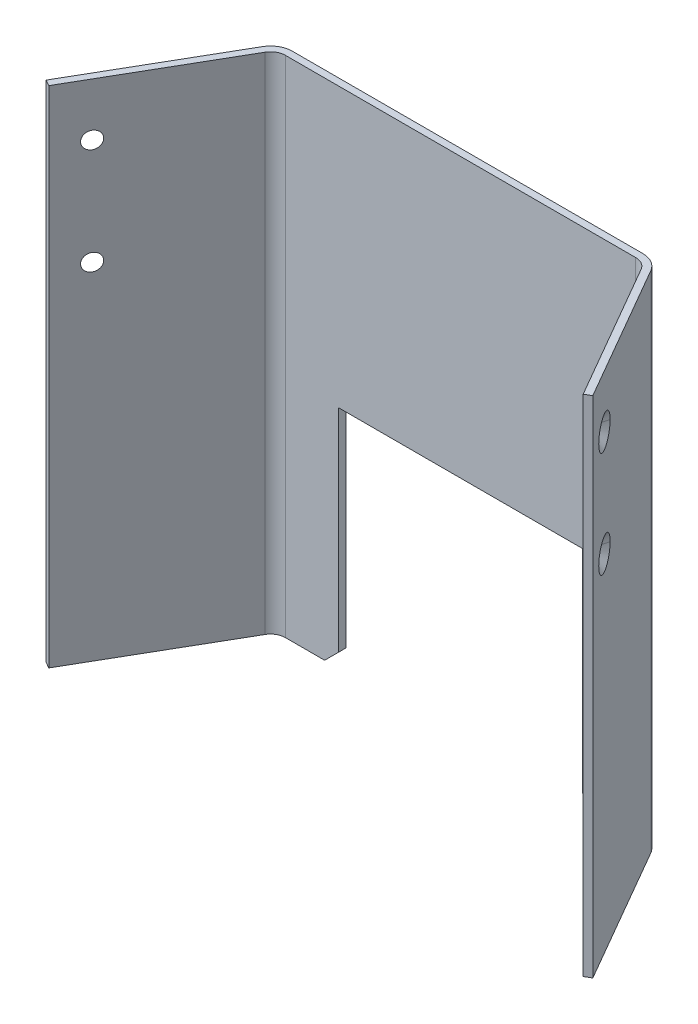
ISO-10303-21;
HEADER;
FILE_DESCRIPTION(('STEP AP214'),'2;1');
FILE_NAME('part.step','',(''),(''),'','','');
FILE_SCHEMA(('AUTOMOTIVE_DESIGN { 1 0 10303 214 1 1 1 1 }'));
ENDSEC;
DATA;
#1=APPLICATION_CONTEXT('core data for automotive mechanical design processes');
#2=APPLICATION_PROTOCOL_DEFINITION('international standard','automotive_design',2000,#1);
#3=PRODUCT_CONTEXT('',#1,'mechanical');
#4=PRODUCT('Part','Part','',(#3));
#5=PRODUCT_RELATED_PRODUCT_CATEGORY('part','',(#4));
#6=PRODUCT_DEFINITION_FORMATION('','',#4);
#7=PRODUCT_DEFINITION_CONTEXT('part definition',#1,'design');
#8=PRODUCT_DEFINITION('design','',#6,#7);
#9=PRODUCT_DEFINITION_SHAPE('','',#8);
#10=(LENGTH_UNIT() NAMED_UNIT(*) SI_UNIT(.MILLI.,.METRE.));
#11=(NAMED_UNIT(*) PLANE_ANGLE_UNIT() SI_UNIT($,.RADIAN.));
#12=(NAMED_UNIT(*) SI_UNIT($,.STERADIAN.) SOLID_ANGLE_UNIT());
#13=UNCERTAINTY_MEASURE_WITH_UNIT(LENGTH_MEASURE(1.E-05),#10,'distance_accuracy_value','');
#14=(GEOMETRIC_REPRESENTATION_CONTEXT(3) GLOBAL_UNCERTAINTY_ASSIGNED_CONTEXT((#13)) GLOBAL_UNIT_ASSIGNED_CONTEXT((#10,
#11,#12)) REPRESENTATION_CONTEXT('',''));
#15=CARTESIAN_POINT('',(0.,0.,0.));
#16=DIRECTION('',(0.,0.,1.));
#17=DIRECTION('',(1.,0.,0.));
#18=AXIS2_PLACEMENT_3D('',#15,#16,#17);
#19=CARTESIAN_POINT('',(-36.5,64.,17.1028856829701));
#20=DIRECTION('',(-0.86602540378444,0.,-0.5));
#21=DIRECTION('',(-0.5,0.,0.86602540378444));
#22=AXIS2_PLACEMENT_3D('',#19,#20,#21);
#23=CONICAL_SURFACE('',#22,2.2,0.78539816339744);
#24=CARTESIAN_POINT('',(-35.6339745962155,64.,17.6028856829701));
#25=DIRECTION('',(-0.866025403784439,0.,-0.5));
#26=DIRECTION('',(-0.5,0.,0.866025403784439));
#27=AXIS2_PLACEMENT_3D('',#24,#25,#26);
#28=CIRCLE('',#27,1.2);
#29=CARTESIAN_POINT('',(-35.0339745962156,64.,16.5636551984287));
#30=VERTEX_POINT('',#29);
#31=CARTESIAN_POINT('',(-36.2339745962156,64.,18.6421161675114));
#32=VERTEX_POINT('',#31);
#33=EDGE_CURVE('E41',#30,#32,#28,.T.);
#34=ORIENTED_EDGE('',*,*,#33,.F.);
#35=DIRECTION('',(-0.258819045102532,0.,-0.965925826289066));
#36=VECTOR('',#35,1.);
#37=CARTESIAN_POINT('',(-35.4,64.,15.1976297946443));
#38=LINE('',#37,#36);
#39=CARTESIAN_POINT('',(-35.4,64.,15.1976297946443));
#40=VERTEX_POINT('',#39);
#41=EDGE_CURVE('E11',#30,#40,#38,.T.);
#42=ORIENTED_EDGE('',*,*,#41,.T.);
#43=CARTESIAN_POINT('',(-36.5,64.,17.1028856829701));
#44=DIRECTION('',(-0.86602540378444,0.,-0.5));
#45=DIRECTION('',(-0.5,0.,0.86602540378444));
#46=AXIS2_PLACEMENT_3D('',#43,#44,#45);
#47=CIRCLE('',#46,2.2);
#48=CARTESIAN_POINT('',(-37.6,64.,19.0081415712958));
#49=VERTEX_POINT('',#48);
#50=EDGE_CURVE('E27',#40,#49,#47,.T.);
#51=ORIENTED_EDGE('',*,*,#50,.T.);
#52=DIRECTION('',(-0.96592582628907,0.,0.258819045102515));
#53=VECTOR('',#52,1.);
#54=CARTESIAN_POINT('',(-37.6,64.,19.0081415712958));
#55=LINE('',#54,#53);
#56=EDGE_CURVE('E262',#32,#49,#55,.T.);
#57=ORIENTED_EDGE('',*,*,#56,.F.);
#58=EDGE_LOOP('',(#34,#42,#51,#57));
#59=FACE_BOUND('',#58,.T.);
#60=ADVANCED_FACE('F16',(#59),#23,.F.);
#61=CARTESIAN_POINT('',(-36.5,49.,17.1028856829701));
#62=DIRECTION('',(-0.86602540378444,0.,-0.5));
#63=DIRECTION('',(-0.5,0.,0.86602540378444));
#64=AXIS2_PLACEMENT_3D('',#61,#62,#63);
#65=CONICAL_SURFACE('',#64,2.2,0.785398163397447);
#66=CARTESIAN_POINT('',(-35.6339745962155,49.,17.6028856829701));
#67=DIRECTION('',(-0.866025403784441,0.,-0.5));
#68=DIRECTION('',(-0.5,0.,0.866025403784441));
#69=AXIS2_PLACEMENT_3D('',#66,#67,#68);
#70=CIRCLE('',#69,1.2);
#71=CARTESIAN_POINT('',(-35.0339745962156,49.,16.5636551984287));
#72=VERTEX_POINT('',#71);
#73=CARTESIAN_POINT('',(-36.2339745962156,49.,18.6421161675114));
#74=VERTEX_POINT('',#73);
#75=EDGE_CURVE('E311',#72,#74,#70,.T.);
#76=ORIENTED_EDGE('',*,*,#75,.F.);
#77=DIRECTION('',(-0.258819045102525,0.,-0.965925826289067));
#78=VECTOR('',#77,1.);
#79=CARTESIAN_POINT('',(-35.4,49.,15.1976297946443));
#80=LINE('',#79,#78);
#81=CARTESIAN_POINT('',(-35.4,49.,15.1976297946443));
#82=VERTEX_POINT('',#81);
#83=EDGE_CURVE('E255',#72,#82,#80,.T.);
#84=ORIENTED_EDGE('',*,*,#83,.T.);
#85=CARTESIAN_POINT('',(-36.5,49.,17.1028856829701));
#86=DIRECTION('',(-0.86602540378444,0.,-0.5));
#87=DIRECTION('',(-0.5,0.,0.86602540378444));
#88=AXIS2_PLACEMENT_3D('',#85,#86,#87);
#89=CIRCLE('',#88,2.2);
#90=CARTESIAN_POINT('',(-37.6,49.,19.0081415712958));
#91=VERTEX_POINT('',#90);
#92=EDGE_CURVE('E253',#82,#91,#89,.T.);
#93=ORIENTED_EDGE('',*,*,#92,.T.);
#94=DIRECTION('',(-0.965925826289068,0.,0.258819045102522));
#95=VECTOR('',#94,1.);
#96=CARTESIAN_POINT('',(-37.6,49.,19.0081415712958));
#97=LINE('',#96,#95);
#98=EDGE_CURVE('E235',#74,#91,#97,.T.);
#99=ORIENTED_EDGE('',*,*,#98,.F.);
#100=EDGE_LOOP('',(#76,#84,#93,#99));
#101=FACE_BOUND('',#100,.T.);
#102=ADVANCED_FACE('F254',(#101),#65,.F.);
#103=CARTESIAN_POINT('',(36.5,64.,17.1028856829701));
#104=DIRECTION('',(0.866025403784439,0.,-0.5));
#105=DIRECTION('',(-0.5,0.,-0.866025403784439));
#106=AXIS2_PLACEMENT_3D('',#103,#104,#105);
#107=CONICAL_SURFACE('',#106,2.2,0.785398163397443);
#108=CARTESIAN_POINT('',(35.6339745962156,64.,17.6028856829701));
#109=DIRECTION('',(0.866025403784439,0.,-0.5));
#110=DIRECTION('',(-0.5,0.,-0.866025403784439));
#111=AXIS2_PLACEMENT_3D('',#108,#109,#110);
#112=CIRCLE('',#111,1.2);
#113=CARTESIAN_POINT('',(36.2339745962156,64.,18.6421161675114));
#114=VERTEX_POINT('',#113);
#115=CARTESIAN_POINT('',(35.0339745962156,64.,16.5636551984287));
#116=VERTEX_POINT('',#115);
#117=EDGE_CURVE('E310',#114,#116,#112,.T.);
#118=ORIENTED_EDGE('',*,*,#117,.F.);
#119=DIRECTION('',(0.96592582628907,0.,0.258819045102516));
#120=VECTOR('',#119,1.);
#121=CARTESIAN_POINT('',(37.6,64.,19.0081415712958));
#122=LINE('',#121,#120);
#123=CARTESIAN_POINT('',(37.6,64.,19.0081415712958));
#124=VERTEX_POINT('',#123);
#125=EDGE_CURVE('E258',#114,#124,#122,.T.);
#126=ORIENTED_EDGE('',*,*,#125,.T.);
#127=CARTESIAN_POINT('',(36.5,64.,17.1028856829701));
#128=DIRECTION('',(0.866025403784439,0.,-0.5));
#129=DIRECTION('',(-0.5,0.,-0.866025403784439));
#130=AXIS2_PLACEMENT_3D('',#127,#128,#129);
#131=CIRCLE('',#130,2.2);
#132=CARTESIAN_POINT('',(35.4,64.,15.1976297946443));
#133=VERTEX_POINT('',#132);
#134=EDGE_CURVE('E407',#124,#133,#131,.T.);
#135=ORIENTED_EDGE('',*,*,#134,.T.);
#136=DIRECTION('',(0.258819045102526,0.,-0.965925826289067));
#137=VECTOR('',#136,1.);
#138=CARTESIAN_POINT('',(35.4,64.,15.1976297946443));
#139=LINE('',#138,#137);
#140=EDGE_CURVE('E208',#116,#133,#139,.T.);
#141=ORIENTED_EDGE('',*,*,#140,.F.);
#142=EDGE_LOOP('',(#118,#126,#135,#141));
#143=FACE_BOUND('',#142,.T.);
#144=ADVANCED_FACE('F624',(#143),#107,.F.);
#145=CARTESIAN_POINT('',(36.5,49.,17.1028856829701));
#146=DIRECTION('',(0.866025403784438,0.,-0.5));
#147=DIRECTION('',(-0.5,0.,-0.866025403784438));
#148=AXIS2_PLACEMENT_3D('',#145,#146,#147);
#149=CONICAL_SURFACE('',#148,2.2,0.78539816339745);
#150=CARTESIAN_POINT('',(35.6339745962156,49.,17.6028856829701));
#151=DIRECTION('',(0.866025403784438,0.,-0.5));
#152=DIRECTION('',(-0.5,0.,-0.866025403784438));
#153=AXIS2_PLACEMENT_3D('',#150,#151,#152);
#154=CIRCLE('',#153,1.2);
#155=CARTESIAN_POINT('',(36.2339745962156,49.,18.6421161675114));
#156=VERTEX_POINT('',#155);
#157=CARTESIAN_POINT('',(35.0339745962156,49.,16.5636551984287));
#158=VERTEX_POINT('',#157);
#159=EDGE_CURVE('E291',#156,#158,#154,.T.);
#160=ORIENTED_EDGE('',*,*,#159,.F.);
#161=DIRECTION('',(0.965925826289068,0.,0.258819045102522));
#162=VECTOR('',#161,1.);
#163=CARTESIAN_POINT('',(37.6,49.,19.0081415712958));
#164=LINE('',#163,#162);
#165=CARTESIAN_POINT('',(37.6,49.,19.0081415712958));
#166=VERTEX_POINT('',#165);
#167=EDGE_CURVE('E354',#156,#166,#164,.T.);
#168=ORIENTED_EDGE('',*,*,#167,.T.);
#169=CARTESIAN_POINT('',(36.5,49.,17.1028856829701));
#170=DIRECTION('',(0.866025403784438,0.,-0.5));
#171=DIRECTION('',(-0.5,0.,-0.866025403784438));
#172=AXIS2_PLACEMENT_3D('',#169,#170,#171);
#173=CIRCLE('',#172,2.2);
#174=CARTESIAN_POINT('',(35.4,49.,15.1976297946443));
#175=VERTEX_POINT('',#174);
#176=EDGE_CURVE('E350',#166,#175,#173,.T.);
#177=ORIENTED_EDGE('',*,*,#176,.T.);
#178=DIRECTION('',(0.258819045102519,0.,-0.965925826289069));
#179=VECTOR('',#178,1.);
#180=CARTESIAN_POINT('',(35.4,49.,15.1976297946443));
#181=LINE('',#180,#179);
#182=EDGE_CURVE('E448',#158,#175,#181,.T.);
#183=ORIENTED_EDGE('',*,*,#182,.F.);
#184=EDGE_LOOP('',(#160,#168,#177,#183));
#185=FACE_BOUND('',#184,.T.);
#186=ADVANCED_FACE('F680',(#185),#149,.F.);
#187=CARTESIAN_POINT('',(24.83585851253,0.,3.1));
#188=DIRECTION('',(0.,-1.,0.));
#189=DIRECTION('',(0.,0.,-1.));
#190=AXIS2_PLACEMENT_3D('',#187,#188,#189);
#191=PLANE('',#190);
#192=DIRECTION('',(1.,0.,0.));
#193=VECTOR('',#192,1.);
#194=CARTESIAN_POINT('',(-24.83585851253,0.,1.));
#195=LINE('',#194,#193);
#196=CARTESIAN_POINT('',(19.2710634256353,0.,1.));
#197=VERTEX_POINT('',#196);
#198=CARTESIAN_POINT('',(24.83585851253,0.,1.));
#199=VERTEX_POINT('',#198);
#200=EDGE_CURVE('E333',#197,#199,#195,.T.);
#201=ORIENTED_EDGE('',*,*,#200,.F.);
#202=DIRECTION('',(0.,0.,-1.));
#203=VECTOR('',#202,1.);
#204=CARTESIAN_POINT('',(19.2710634256353,0.,0.));
#205=LINE('',#204,#203);
#206=CARTESIAN_POINT('',(19.2710634256353,0.,0.));
#207=VERTEX_POINT('',#206);
#208=EDGE_CURVE('E355',#197,#207,#205,.T.);
#209=ORIENTED_EDGE('',*,*,#208,.T.);
#210=DIRECTION('',(1.,0.,0.));
#211=VECTOR('',#210,1.);
#212=CARTESIAN_POINT('',(-24.83585851253,0.,0.));
#213=LINE('',#212,#211);
#214=CARTESIAN_POINT('',(24.83585851253,0.,0.));
#215=VERTEX_POINT('',#214);
#216=EDGE_CURVE('E367',#207,#215,#213,.T.);
#217=ORIENTED_EDGE('',*,*,#216,.T.);
#218=CARTESIAN_POINT('',(24.83585851253,0.,3.1));
#219=DIRECTION('',(0.,-1.,0.));
#220=DIRECTION('',(0.,0.,1.));
#221=AXIS2_PLACEMENT_3D('',#218,#219,#220);
#222=CIRCLE('',#221,3.1);
#223=CARTESIAN_POINT('',(27.5205372642618,0.,1.55));
#224=VERTEX_POINT('',#223);
#225=EDGE_CURVE('E318',#215,#224,#222,.T.);
#226=ORIENTED_EDGE('',*,*,#225,.T.);
#227=DIRECTION('',(0.5,0.,0.866025403784439));
#228=VECTOR('',#227,1.);
#229=CARTESIAN_POINT('',(27.5205372642618,0.,1.55));
#230=LINE('',#229,#228);
#231=CARTESIAN_POINT('',(38.75,0.,21.));
#232=VERTEX_POINT('',#231);
#233=EDGE_CURVE('E314',#224,#232,#230,.T.);
#234=ORIENTED_EDGE('',*,*,#233,.T.);
#235=DIRECTION('',(-0.866025403784443,0.,0.499999999999993));
#236=VECTOR('',#235,1.);
#237=CARTESIAN_POINT('',(38.75,0.,21.));
#238=LINE('',#237,#236);
#239=CARTESIAN_POINT('',(37.8839745962156,0.,21.5));
#240=VERTEX_POINT('',#239);
#241=EDGE_CURVE('E319',#232,#240,#238,.T.);
#242=ORIENTED_EDGE('',*,*,#241,.T.);
#243=DIRECTION('',(0.5,0.,0.866025403784439));
#244=VECTOR('',#243,1.);
#245=CARTESIAN_POINT('',(26.6545118604773,0.,2.05));
#246=LINE('',#245,#244);
#247=CARTESIAN_POINT('',(26.6545118604773,0.,2.05));
#248=VERTEX_POINT('',#247);
#249=EDGE_CURVE('E417',#248,#240,#246,.T.);
#250=ORIENTED_EDGE('',*,*,#249,.F.);
#251=CARTESIAN_POINT('',(24.83585851253,0.,3.1));
#252=DIRECTION('',(0.,-1.,0.));
#253=DIRECTION('',(1.,0.,0.));
#254=AXIS2_PLACEMENT_3D('',#251,#252,#253);
#255=CIRCLE('',#254,2.1);
#256=EDGE_CURVE('E334',#199,#248,#255,.T.);
#257=ORIENTED_EDGE('',*,*,#256,.F.);
#258=EDGE_LOOP('',(#201,#209,#217,#226,#234,#242,#250,#257));
#259=FACE_BOUND('',#258,.T.);
#260=ADVANCED_FACE('F18',(#259),#191,.T.);
#261=CARTESIAN_POINT('',(26.6545118604773,71.5,2.05));
#262=DIRECTION('',(0.866025403784439,0.,-0.5));
#263=DIRECTION('',(0.,-1.,0.));
#264=AXIS2_PLACEMENT_3D('',#261,#262,#263);
#265=PLANE('',#264);
#266=ORIENTED_EDGE('',*,*,#249,.T.);
#267=DIRECTION('',(0.,-1.,0.));
#268=VECTOR('',#267,1.);
#269=CARTESIAN_POINT('',(37.8839745962156,71.5,21.5));
#270=LINE('',#269,#268);
#271=CARTESIAN_POINT('',(37.8839745962156,71.5,21.5));
#272=VERTEX_POINT('',#271);
#273=EDGE_CURVE('E388',#272,#240,#270,.T.);
#274=ORIENTED_EDGE('',*,*,#273,.F.);
#275=DIRECTION('',(0.5,0.,0.866025403784439));
#276=VECTOR('',#275,1.);
#277=CARTESIAN_POINT('',(26.6545118604773,71.5,2.05));
#278=LINE('',#277,#276);
#279=CARTESIAN_POINT('',(26.6545118604773,71.5,2.05));
#280=VERTEX_POINT('',#279);
#281=EDGE_CURVE('E372',#280,#272,#278,.T.);
#282=ORIENTED_EDGE('',*,*,#281,.F.);
#283=DIRECTION('',(0.,-1.,0.));
#284=VECTOR('',#283,1.);
#285=CARTESIAN_POINT('',(26.6545118604773,71.5,2.05));
#286=LINE('',#285,#284);
#287=EDGE_CURVE('E420',#280,#248,#286,.T.);
#288=ORIENTED_EDGE('',*,*,#287,.T.);
#289=EDGE_LOOP('',(#266,#274,#282,#288));
#290=FACE_BOUND('',#289,.T.);
#291=CARTESIAN_POINT('',(35.6339745962156,64.,17.6028856829701));
#292=DIRECTION('',(0.866025403784439,0.,-0.5));
#293=DIRECTION('',(-0.5,0.,-0.866025403784439));
#294=AXIS2_PLACEMENT_3D('',#291,#292,#293);
#295=CIRCLE('',#294,1.2);
#296=EDGE_CURVE('E381',#116,#114,#295,.T.);
#297=ORIENTED_EDGE('',*,*,#296,.T.);
#298=ORIENTED_EDGE('',*,*,#117,.T.);
#299=EDGE_LOOP('',(#297,#298));
#300=FACE_BOUND('',#299,.T.);
#301=CARTESIAN_POINT('',(35.6339745962156,49.,17.6028856829701));
#302=DIRECTION('',(0.866025403784438,0.,-0.5));
#303=DIRECTION('',(-0.5,0.,-0.866025403784438));
#304=AXIS2_PLACEMENT_3D('',#301,#302,#303);
#305=CIRCLE('',#304,1.2);
#306=EDGE_CURVE('E294',#158,#156,#305,.T.);
#307=ORIENTED_EDGE('',*,*,#306,.T.);
#308=ORIENTED_EDGE('',*,*,#159,.T.);
#309=EDGE_LOOP('',(#307,#308));
#310=FACE_BOUND('',#309,.T.);
#311=ADVANCED_FACE('F550',(#290,#300,#310),#265,.F.);
#312=CARTESIAN_POINT('',(38.75,71.5,21.));
#313=DIRECTION('',(0.499999999999993,0.,0.866025403784443));
#314=DIRECTION('',(0.,-1.,0.));
#315=AXIS2_PLACEMENT_3D('',#312,#313,#314);
#316=PLANE('',#315);
#317=ORIENTED_EDGE('',*,*,#241,.F.);
#318=DIRECTION('',(0.,-1.,0.));
#319=VECTOR('',#318,1.);
#320=CARTESIAN_POINT('',(38.75,71.5,21.));
#321=LINE('',#320,#319);
#322=CARTESIAN_POINT('',(38.75,71.5,21.));
#323=VERTEX_POINT('',#322);
#324=EDGE_CURVE('E279',#323,#232,#321,.T.);
#325=ORIENTED_EDGE('',*,*,#324,.F.);
#326=DIRECTION('',(-0.866025403784443,0.,0.499999999999993));
#327=VECTOR('',#326,1.);
#328=CARTESIAN_POINT('',(38.75,71.5,21.));
#329=LINE('',#328,#327);
#330=EDGE_CURVE('E274',#323,#272,#329,.T.);
#331=ORIENTED_EDGE('',*,*,#330,.T.);
#332=ORIENTED_EDGE('',*,*,#273,.T.);
#333=EDGE_LOOP('',(#317,#325,#331,#332));
#334=FACE_BOUND('',#333,.T.);
#335=ADVANCED_FACE('F644',(#334),#316,.T.);
#336=CARTESIAN_POINT('',(27.5205372642618,71.5,1.55));
#337=DIRECTION('',(0.866025403784439,0.,-0.5));
#338=DIRECTION('',(0.,-1.,0.));
#339=AXIS2_PLACEMENT_3D('',#336,#337,#338);
#340=PLANE('',#339);
#341=ORIENTED_EDGE('',*,*,#233,.F.);
#342=DIRECTION('',(0.,-1.,0.));
#343=VECTOR('',#342,1.);
#344=CARTESIAN_POINT('',(27.5205372642618,71.5,1.55));
#345=LINE('',#344,#343);
#346=CARTESIAN_POINT('',(27.5205372642618,71.5,1.55));
#347=VERTEX_POINT('',#346);
#348=EDGE_CURVE('E280',#347,#224,#345,.T.);
#349=ORIENTED_EDGE('',*,*,#348,.F.);
#350=DIRECTION('',(0.5,0.,0.866025403784439));
#351=VECTOR('',#350,1.);
#352=CARTESIAN_POINT('',(27.5205372642618,71.5,1.55));
#353=LINE('',#352,#351);
#354=EDGE_CURVE('E392',#347,#323,#353,.T.);
#355=ORIENTED_EDGE('',*,*,#354,.T.);
#356=ORIENTED_EDGE('',*,*,#324,.T.);
#357=EDGE_LOOP('',(#341,#349,#355,#356));
#358=FACE_BOUND('',#357,.T.);
#359=CARTESIAN_POINT('',(36.5,64.,17.1028856829701));
#360=DIRECTION('',(0.866025403784439,0.,-0.5));
#361=DIRECTION('',(-0.5,0.,-0.866025403784439));
#362=AXIS2_PLACEMENT_3D('',#359,#360,#361);
#363=CIRCLE('',#362,2.2);
#364=EDGE_CURVE('E250',#133,#124,#363,.T.);
#365=ORIENTED_EDGE('',*,*,#364,.F.);
#366=ORIENTED_EDGE('',*,*,#134,.F.);
#367=EDGE_LOOP('',(#365,#366));
#368=FACE_BOUND('',#367,.T.);
#369=CARTESIAN_POINT('',(36.5,49.,17.1028856829701));
#370=DIRECTION('',(0.866025403784438,0.,-0.5));
#371=DIRECTION('',(-0.5,0.,-0.866025403784438));
#372=AXIS2_PLACEMENT_3D('',#369,#370,#371);
#373=CIRCLE('',#372,2.2);
#374=EDGE_CURVE('E446',#175,#166,#373,.T.);
#375=ORIENTED_EDGE('',*,*,#374,.F.);
#376=ORIENTED_EDGE('',*,*,#176,.F.);
#377=EDGE_LOOP('',(#375,#376));
#378=FACE_BOUND('',#377,.T.);
#379=ADVANCED_FACE('F575',(#358,#368,#378),#340,.T.);
#380=CARTESIAN_POINT('',(24.83585851253,71.5,3.1));
#381=DIRECTION('',(0.,-1.,0.));
#382=DIRECTION('',(0.,0.,-1.));
#383=AXIS2_PLACEMENT_3D('',#380,#381,#382);
#384=CYLINDRICAL_SURFACE('',#383,3.1);
#385=ORIENTED_EDGE('',*,*,#225,.F.);
#386=DIRECTION('',(0.,-1.,0.));
#387=VECTOR('',#386,1.);
#388=CARTESIAN_POINT('',(24.83585851253,71.5,0.));
#389=LINE('',#388,#387);
#390=CARTESIAN_POINT('',(24.83585851253,71.5,0.));
#391=VERTEX_POINT('',#390);
#392=EDGE_CURVE('E377',#391,#215,#389,.T.);
#393=ORIENTED_EDGE('',*,*,#392,.F.);
#394=CARTESIAN_POINT('',(24.83585851253,71.5,3.1));
#395=DIRECTION('',(0.,-1.,0.));
#396=DIRECTION('',(0.,0.,1.));
#397=AXIS2_PLACEMENT_3D('',#394,#395,#396);
#398=CIRCLE('',#397,3.1);
#399=EDGE_CURVE('E276',#391,#347,#398,.T.);
#400=ORIENTED_EDGE('',*,*,#399,.T.);
#401=ORIENTED_EDGE('',*,*,#348,.T.);
#402=EDGE_LOOP('',(#385,#393,#400,#401));
#403=FACE_BOUND('',#402,.T.);
#404=ADVANCED_FACE('F572',(#403),#384,.T.);
#405=CARTESIAN_POINT('',(-24.83585851253,71.5,0.));
#406=DIRECTION('',(0.,0.,-1.));
#407=DIRECTION('',(0.,-1.,0.));
#408=AXIS2_PLACEMENT_3D('',#405,#406,#407);
#409=PLANE('',#408);
#410=DIRECTION('',(0.,1.,0.));
#411=VECTOR('',#410,1.);
#412=CARTESIAN_POINT('',(-17.2710634256352,0.,0.));
#413=LINE('',#412,#411);
#414=CARTESIAN_POINT('',(-17.2710634256352,2.,0.));
#415=VERTEX_POINT('',#414);
#416=CARTESIAN_POINT('',(-17.2710634256352,32.,0.));
#417=VERTEX_POINT('',#416);
#418=EDGE_CURVE('E451',#415,#417,#413,.T.);
#419=ORIENTED_EDGE('',*,*,#418,.F.);
#420=DIRECTION('',(-0.70710678118655,-0.707106781186545,0.));
#421=VECTOR('',#420,1.);
#422=CARTESIAN_POINT('',(13.6965390309174,32.9676024565523,0.));
#423=LINE('',#422,#421);
#424=CARTESIAN_POINT('',(-19.2710634256352,0.,0.));
#425=VERTEX_POINT('',#424);
#426=EDGE_CURVE('E436',#415,#425,#423,.T.);
#427=ORIENTED_EDGE('',*,*,#426,.T.);
#428=DIRECTION('',(1.,0.,0.));
#429=VECTOR('',#428,1.);
#430=CARTESIAN_POINT('',(-24.83585851253,0.,0.));
#431=LINE('',#430,#429);
#432=CARTESIAN_POINT('',(-24.83585851253,0.,0.));
#433=VERTEX_POINT('',#432);
#434=EDGE_CURVE('E305',#433,#425,#431,.T.);
#435=ORIENTED_EDGE('',*,*,#434,.F.);
#436=DIRECTION('',(0.,-1.,0.));
#437=VECTOR('',#436,1.);
#438=CARTESIAN_POINT('',(-24.83585851253,71.5,0.));
#439=LINE('',#438,#437);
#440=CARTESIAN_POINT('',(-24.83585851253,71.5,0.));
#441=VERTEX_POINT('',#440);
#442=EDGE_CURVE('E456',#441,#433,#439,.T.);
#443=ORIENTED_EDGE('',*,*,#442,.F.);
#444=DIRECTION('',(1.,0.,0.));
#445=VECTOR('',#444,1.);
#446=CARTESIAN_POINT('',(-24.83585851253,71.5,0.));
#447=LINE('',#446,#445);
#448=EDGE_CURVE('E396',#441,#391,#447,.T.);
#449=ORIENTED_EDGE('',*,*,#448,.T.);
#450=ORIENTED_EDGE('',*,*,#392,.T.);
#451=ORIENTED_EDGE('',*,*,#216,.F.);
#452=DIRECTION('',(-0.707106781186548,0.707106781186548,0.));
#453=VECTOR('',#452,1.);
#454=CARTESIAN_POINT('',(-38.5323975434474,57.8034609690827,0.));
#455=LINE('',#454,#453);
#456=CARTESIAN_POINT('',(17.2710634256353,2.,0.));
#457=VERTEX_POINT('',#456);
#458=EDGE_CURVE('E373',#207,#457,#455,.T.);
#459=ORIENTED_EDGE('',*,*,#458,.T.);
#460=DIRECTION('',(0.,-1.,0.));
#461=VECTOR('',#460,1.);
#462=CARTESIAN_POINT('',(17.2710634256352,0.,0.));
#463=LINE('',#462,#461);
#464=CARTESIAN_POINT('',(17.2710634256352,32.,0.));
#465=VERTEX_POINT('',#464);
#466=EDGE_CURVE('E320',#465,#457,#463,.T.);
#467=ORIENTED_EDGE('',*,*,#466,.F.);
#468=DIRECTION('',(1.,0.,0.));
#469=VECTOR('',#468,1.);
#470=CARTESIAN_POINT('',(17.2710634256352,32.,0.));
#471=LINE('',#470,#469);
#472=EDGE_CURVE('E323',#417,#465,#471,.T.);
#473=ORIENTED_EDGE('',*,*,#472,.F.);
#474=EDGE_LOOP('',(#419,#427,#435,#443,#449,#450,#451,#459,#467,#473));
#475=FACE_BOUND('',#474,.T.);
#476=ADVANCED_FACE('F569',(#475),#409,.T.);
#477=CARTESIAN_POINT('',(-24.83585851253,71.5,3.1));
#478=DIRECTION('',(0.,-1.,0.));
#479=DIRECTION('',(0.,0.,-1.));
#480=AXIS2_PLACEMENT_3D('',#477,#478,#479);
#481=CYLINDRICAL_SURFACE('',#480,3.1);
#482=CARTESIAN_POINT('',(-24.83585851253,0.,3.1));
#483=DIRECTION('',(0.,-1.,0.));
#484=DIRECTION('',(0.,0.,1.));
#485=AXIS2_PLACEMENT_3D('',#482,#483,#484);
#486=CIRCLE('',#485,3.1);
#487=CARTESIAN_POINT('',(-27.5205372642618,0.,1.55));
#488=VERTEX_POINT('',#487);
#489=EDGE_CURVE('E345',#488,#433,#486,.T.);
#490=ORIENTED_EDGE('',*,*,#489,.F.);
#491=DIRECTION('',(0.,-1.,0.));
#492=VECTOR('',#491,1.);
#493=CARTESIAN_POINT('',(-27.5205372642618,71.5,1.55));
#494=LINE('',#493,#492);
#495=CARTESIAN_POINT('',(-27.5205372642618,71.5,1.55));
#496=VERTEX_POINT('',#495);
#497=EDGE_CURVE('E457',#496,#488,#494,.T.);
#498=ORIENTED_EDGE('',*,*,#497,.F.);
#499=CARTESIAN_POINT('',(-24.83585851253,71.5,3.1));
#500=DIRECTION('',(0.,-1.,0.));
#501=DIRECTION('',(0.,0.,1.));
#502=AXIS2_PLACEMENT_3D('',#499,#500,#501);
#503=CIRCLE('',#502,3.1);
#504=EDGE_CURVE('E378',#496,#441,#503,.T.);
#505=ORIENTED_EDGE('',*,*,#504,.T.);
#506=ORIENTED_EDGE('',*,*,#442,.T.);
#507=EDGE_LOOP('',(#490,#498,#505,#506));
#508=FACE_BOUND('',#507,.T.);
#509=ADVANCED_FACE('F581',(#508),#481,.T.);
#510=CARTESIAN_POINT('',(-38.75,71.5,21.));
#511=DIRECTION('',(-0.86602540378444,0.,-0.5));
#512=DIRECTION('',(-0.5,0.,0.86602540378444));
#513=AXIS2_PLACEMENT_3D('',#510,#511,#512);
#514=PLANE('',#513);
#515=DIRECTION('',(0.5,0.,-0.86602540378444));
#516=VECTOR('',#515,1.);
#517=CARTESIAN_POINT('',(-38.75,0.,21.));
#518=LINE('',#517,#516);
#519=CARTESIAN_POINT('',(-38.75,0.,21.));
#520=VERTEX_POINT('',#519);
#521=EDGE_CURVE('E349',#520,#488,#518,.T.);
#522=ORIENTED_EDGE('',*,*,#521,.F.);
#523=DIRECTION('',(0.,-1.,0.));
#524=VECTOR('',#523,1.);
#525=CARTESIAN_POINT('',(-38.75,71.5,21.));
#526=LINE('',#525,#524);
#527=CARTESIAN_POINT('',(-38.75,71.5,21.));
#528=VERTEX_POINT('',#527);
#529=EDGE_CURVE('E414',#528,#520,#526,.T.);
#530=ORIENTED_EDGE('',*,*,#529,.F.);
#531=DIRECTION('',(0.5,0.,-0.86602540378444));
#532=VECTOR('',#531,1.);
#533=CARTESIAN_POINT('',(-38.75,71.5,21.));
#534=LINE('',#533,#532);
#535=EDGE_CURVE('E452',#528,#496,#534,.T.);
#536=ORIENTED_EDGE('',*,*,#535,.T.);
#537=ORIENTED_EDGE('',*,*,#497,.T.);
#538=EDGE_LOOP('',(#522,#530,#536,#537));
#539=FACE_BOUND('',#538,.T.);
#540=CARTESIAN_POINT('',(-36.5,64.,17.1028856829701));
#541=DIRECTION('',(-0.86602540378444,0.,-0.5));
#542=DIRECTION('',(-0.5,0.,0.86602540378444));
#543=AXIS2_PLACEMENT_3D('',#540,#541,#542);
#544=CIRCLE('',#543,2.2);
#545=EDGE_CURVE('E270',#49,#40,#544,.T.);
#546=ORIENTED_EDGE('',*,*,#545,.F.);
#547=ORIENTED_EDGE('',*,*,#50,.F.);
#548=EDGE_LOOP('',(#546,#547));
#549=FACE_BOUND('',#548,.T.);
#550=CARTESIAN_POINT('',(-36.5,49.,17.1028856829701));
#551=DIRECTION('',(-0.86602540378444,0.,-0.5));
#552=DIRECTION('',(-0.5,0.,0.86602540378444));
#553=AXIS2_PLACEMENT_3D('',#550,#551,#552);
#554=CIRCLE('',#553,2.2);
#555=EDGE_CURVE('E246',#91,#82,#554,.T.);
#556=ORIENTED_EDGE('',*,*,#555,.F.);
#557=ORIENTED_EDGE('',*,*,#92,.F.);
#558=EDGE_LOOP('',(#556,#557));
#559=FACE_BOUND('',#558,.T.);
#560=ADVANCED_FACE('F260',(#539,#549,#559),#514,.T.);
#561=CARTESIAN_POINT('',(-37.8839745962156,71.5,21.5));
#562=DIRECTION('',(-0.5,0.,0.866025403784441));
#563=DIRECTION('',(0.,1.,0.));
#564=AXIS2_PLACEMENT_3D('',#561,#562,#563);
#565=PLANE('',#564);
#566=DIRECTION('',(-0.866025403784441,0.,-0.5));
#567=VECTOR('',#566,1.);
#568=CARTESIAN_POINT('',(-37.8839745962156,0.,21.5));
#569=LINE('',#568,#567);
#570=CARTESIAN_POINT('',(-37.8839745962156,0.,21.5));
#571=VERTEX_POINT('',#570);
#572=EDGE_CURVE('E306',#571,#520,#569,.T.);
#573=ORIENTED_EDGE('',*,*,#572,.F.);
#574=DIRECTION('',(0.,-1.,0.));
#575=VECTOR('',#574,1.);
#576=CARTESIAN_POINT('',(-37.8839745962156,71.5,21.5));
#577=LINE('',#576,#575);
#578=CARTESIAN_POINT('',(-37.8839745962156,71.5,21.5));
#579=VERTEX_POINT('',#578);
#580=EDGE_CURVE('E300',#579,#571,#577,.T.);
#581=ORIENTED_EDGE('',*,*,#580,.F.);
#582=DIRECTION('',(-0.866025403784441,0.,-0.5));
#583=VECTOR('',#582,1.);
#584=CARTESIAN_POINT('',(-37.8839745962156,71.5,21.5));
#585=LINE('',#584,#583);
#586=EDGE_CURVE('E477',#579,#528,#585,.T.);
#587=ORIENTED_EDGE('',*,*,#586,.T.);
#588=ORIENTED_EDGE('',*,*,#529,.T.);
#589=EDGE_LOOP('',(#573,#581,#587,#588));
#590=FACE_BOUND('',#589,.T.);
#591=ADVANCED_FACE('F609',(#590),#565,.T.);
#592=CARTESIAN_POINT('',(-37.8839745962156,71.5,21.5));
#593=DIRECTION('',(-0.86602540378444,0.,-0.5));
#594=DIRECTION('',(-0.5,0.,0.86602540378444));
#595=AXIS2_PLACEMENT_3D('',#592,#593,#594);
#596=PLANE('',#595);
#597=DIRECTION('',(0.5,0.,-0.86602540378444));
#598=VECTOR('',#597,1.);
#599=CARTESIAN_POINT('',(-37.8839745962156,0.,21.5));
#600=LINE('',#599,#598);
#601=CARTESIAN_POINT('',(-26.6545118604773,0.,2.05));
#602=VERTEX_POINT('',#601);
#603=EDGE_CURVE('E410',#571,#602,#600,.T.);
#604=ORIENTED_EDGE('',*,*,#603,.T.);
#605=DIRECTION('',(0.,-1.,0.));
#606=VECTOR('',#605,1.);
#607=CARTESIAN_POINT('',(-26.6545118604773,71.5,2.05));
#608=LINE('',#607,#606);
#609=CARTESIAN_POINT('',(-26.6545118604773,71.5,2.05));
#610=VERTEX_POINT('',#609);
#611=EDGE_CURVE('E286',#610,#602,#608,.T.);
#612=ORIENTED_EDGE('',*,*,#611,.F.);
#613=DIRECTION('',(0.5,0.,-0.86602540378444));
#614=VECTOR('',#613,1.);
#615=CARTESIAN_POINT('',(-37.8839745962156,71.5,21.5));
#616=LINE('',#615,#614);
#617=EDGE_CURVE('E284',#579,#610,#616,.T.);
#618=ORIENTED_EDGE('',*,*,#617,.F.);
#619=ORIENTED_EDGE('',*,*,#580,.T.);
#620=EDGE_LOOP('',(#604,#612,#618,#619));
#621=FACE_BOUND('',#620,.T.);
#622=CARTESIAN_POINT('',(-35.6339745962155,64.,17.6028856829701));
#623=DIRECTION('',(-0.866025403784439,0.,-0.5));
#624=DIRECTION('',(-0.5,0.,0.866025403784439));
#625=AXIS2_PLACEMENT_3D('',#622,#623,#624);
#626=CIRCLE('',#625,1.2);
#627=EDGE_CURVE('E296',#32,#30,#626,.T.);
#628=ORIENTED_EDGE('',*,*,#627,.T.);
#629=ORIENTED_EDGE('',*,*,#33,.T.);
#630=EDGE_LOOP('',(#628,#629));
#631=FACE_BOUND('',#630,.T.);
#632=CARTESIAN_POINT('',(-35.6339745962155,49.,17.6028856829701));
#633=DIRECTION('',(-0.866025403784441,0.,-0.5));
#634=DIRECTION('',(-0.5,0.,0.866025403784441));
#635=AXIS2_PLACEMENT_3D('',#632,#633,#634);
#636=CIRCLE('',#635,1.2);
#637=EDGE_CURVE('E248',#74,#72,#636,.T.);
#638=ORIENTED_EDGE('',*,*,#637,.T.);
#639=ORIENTED_EDGE('',*,*,#75,.T.);
#640=EDGE_LOOP('',(#638,#639));
#641=FACE_BOUND('',#640,.T.);
#642=ADVANCED_FACE('F615',(#621,#631,#641),#596,.F.);
#643=CARTESIAN_POINT('',(-24.83585851253,71.5,3.1));
#644=DIRECTION('',(0.,-1.,0.));
#645=DIRECTION('',(0.,0.,-1.));
#646=AXIS2_PLACEMENT_3D('',#643,#644,#645);
#647=CYLINDRICAL_SURFACE('',#646,2.1);
#648=CARTESIAN_POINT('',(-24.83585851253,0.,3.1));
#649=DIRECTION('',(0.,-1.,0.));
#650=DIRECTION('',(1.,0.,0.));
#651=AXIS2_PLACEMENT_3D('',#648,#649,#650);
#652=CIRCLE('',#651,2.1);
#653=CARTESIAN_POINT('',(-24.83585851253,0.,1.));
#654=VERTEX_POINT('',#653);
#655=EDGE_CURVE('E289',#602,#654,#652,.T.);
#656=ORIENTED_EDGE('',*,*,#655,.T.);
#657=DIRECTION('',(0.,-1.,0.));
#658=VECTOR('',#657,1.);
#659=CARTESIAN_POINT('',(-24.83585851253,71.5,1.));
#660=LINE('',#659,#658);
#661=CARTESIAN_POINT('',(-24.83585851253,71.5,1.));
#662=VERTEX_POINT('',#661);
#663=EDGE_CURVE('E330',#662,#654,#660,.T.);
#664=ORIENTED_EDGE('',*,*,#663,.F.);
#665=CARTESIAN_POINT('',(-24.83585851253,71.5,3.1));
#666=DIRECTION('',(0.,-1.,0.));
#667=DIRECTION('',(1.,0.,0.));
#668=AXIS2_PLACEMENT_3D('',#665,#666,#667);
#669=CIRCLE('',#668,2.1);
#670=EDGE_CURVE('E281',#610,#662,#669,.T.);
#671=ORIENTED_EDGE('',*,*,#670,.F.);
#672=ORIENTED_EDGE('',*,*,#611,.T.);
#673=EDGE_LOOP('',(#656,#664,#671,#672));
#674=FACE_BOUND('',#673,.T.);
#675=ADVANCED_FACE('F638',(#674),#647,.F.);
#676=CARTESIAN_POINT('',(-24.83585851253,71.5,1.));
#677=DIRECTION('',(0.,0.,-1.));
#678=DIRECTION('',(0.,-1.,0.));
#679=AXIS2_PLACEMENT_3D('',#676,#677,#678);
#680=PLANE('',#679);
#681=DIRECTION('',(1.,0.,0.));
#682=VECTOR('',#681,1.);
#683=CARTESIAN_POINT('',(-24.83585851253,0.,1.));
#684=LINE('',#683,#682);
#685=CARTESIAN_POINT('',(-19.2710634256352,0.,1.));
#686=VERTEX_POINT('',#685);
#687=EDGE_CURVE('E290',#654,#686,#684,.T.);
#688=ORIENTED_EDGE('',*,*,#687,.T.);
#689=DIRECTION('',(0.70710678118655,0.707106781186545,0.));
#690=VECTOR('',#689,1.);
#691=CARTESIAN_POINT('',(-17.2710634256352,2.,1.));
#692=LINE('',#691,#690);
#693=CARTESIAN_POINT('',(-17.2710634256352,2.,1.));
#694=VERTEX_POINT('',#693);
#695=EDGE_CURVE('E403',#686,#694,#692,.T.);
#696=ORIENTED_EDGE('',*,*,#695,.T.);
#697=DIRECTION('',(0.,1.,0.));
#698=VECTOR('',#697,1.);
#699=CARTESIAN_POINT('',(-17.2710634256352,71.5,1.));
#700=LINE('',#699,#698);
#701=CARTESIAN_POINT('',(-17.2710634256352,32.,1.));
#702=VERTEX_POINT('',#701);
#703=EDGE_CURVE('E339',#694,#702,#700,.T.);
#704=ORIENTED_EDGE('',*,*,#703,.T.);
#705=DIRECTION('',(1.,0.,0.));
#706=VECTOR('',#705,1.);
#707=CARTESIAN_POINT('',(-24.83585851253,32.,1.));
#708=LINE('',#707,#706);
#709=CARTESIAN_POINT('',(17.2710634256352,32.,1.));
#710=VERTEX_POINT('',#709);
#711=EDGE_CURVE('E335',#702,#710,#708,.T.);
#712=ORIENTED_EDGE('',*,*,#711,.T.);
#713=DIRECTION('',(0.,-1.,0.));
#714=VECTOR('',#713,1.);
#715=CARTESIAN_POINT('',(17.2710634256352,71.5,1.));
#716=LINE('',#715,#714);
#717=CARTESIAN_POINT('',(17.2710634256352,2.00000000000003,1.));
#718=VERTEX_POINT('',#717);
#719=EDGE_CURVE('E340',#710,#718,#716,.T.);
#720=ORIENTED_EDGE('',*,*,#719,.T.);
#721=DIRECTION('',(0.707106781186548,-0.707106781186548,0.));
#722=VECTOR('',#721,1.);
#723=CARTESIAN_POINT('',(17.2710634256352,2.,1.));
#724=LINE('',#723,#722);
#725=EDGE_CURVE('E360',#718,#197,#724,.T.);
#726=ORIENTED_EDGE('',*,*,#725,.T.);
#727=ORIENTED_EDGE('',*,*,#200,.T.);
#728=DIRECTION('',(0.,-1.,0.));
#729=VECTOR('',#728,1.);
#730=CARTESIAN_POINT('',(24.83585851253,71.5,1.));
#731=LINE('',#730,#729);
#732=CARTESIAN_POINT('',(24.83585851253,71.5,1.));
#733=VERTEX_POINT('',#732);
#734=EDGE_CURVE('E529',#733,#199,#731,.T.);
#735=ORIENTED_EDGE('',*,*,#734,.F.);
#736=DIRECTION('',(1.,0.,0.));
#737=VECTOR('',#736,1.);
#738=CARTESIAN_POINT('',(-24.83585851253,71.5,1.));
#739=LINE('',#738,#737);
#740=EDGE_CURVE('E285',#662,#733,#739,.T.);
#741=ORIENTED_EDGE('',*,*,#740,.F.);
#742=ORIENTED_EDGE('',*,*,#663,.T.);
#743=EDGE_LOOP('',(#688,#696,#704,#712,#720,#726,#727,#735,#741,#742));
#744=FACE_BOUND('',#743,.T.);
#745=ADVANCED_FACE('F561',(#744),#680,.F.);
#746=CARTESIAN_POINT('',(24.83585851253,71.5,3.1));
#747=DIRECTION('',(0.,-1.,0.));
#748=DIRECTION('',(0.,0.,-1.));
#749=AXIS2_PLACEMENT_3D('',#746,#747,#748);
#750=CYLINDRICAL_SURFACE('',#749,2.1);
#751=ORIENTED_EDGE('',*,*,#256,.T.);
#752=ORIENTED_EDGE('',*,*,#287,.F.);
#753=CARTESIAN_POINT('',(24.83585851253,71.5,3.1));
#754=DIRECTION('',(0.,-1.,0.));
#755=DIRECTION('',(1.,0.,0.));
#756=AXIS2_PLACEMENT_3D('',#753,#754,#755);
#757=CIRCLE('',#756,2.1);
#758=EDGE_CURVE('E387',#733,#280,#757,.T.);
#759=ORIENTED_EDGE('',*,*,#758,.F.);
#760=ORIENTED_EDGE('',*,*,#734,.T.);
#761=EDGE_LOOP('',(#751,#752,#759,#760));
#762=FACE_BOUND('',#761,.T.);
#763=ADVANCED_FACE('F544',(#762),#750,.F.);
#764=CARTESIAN_POINT('',(24.83585851253,71.5,3.1));
#765=DIRECTION('',(0.,-1.,0.));
#766=DIRECTION('',(0.,0.,-1.));
#767=AXIS2_PLACEMENT_3D('',#764,#765,#766);
#768=PLANE('',#767);
#769=ORIENTED_EDGE('',*,*,#281,.T.);
#770=ORIENTED_EDGE('',*,*,#330,.F.);
#771=ORIENTED_EDGE('',*,*,#354,.F.);
#772=ORIENTED_EDGE('',*,*,#399,.F.);
#773=ORIENTED_EDGE('',*,*,#448,.F.);
#774=ORIENTED_EDGE('',*,*,#504,.F.);
#775=ORIENTED_EDGE('',*,*,#535,.F.);
#776=ORIENTED_EDGE('',*,*,#586,.F.);
#777=ORIENTED_EDGE('',*,*,#617,.T.);
#778=ORIENTED_EDGE('',*,*,#670,.T.);
#779=ORIENTED_EDGE('',*,*,#740,.T.);
#780=ORIENTED_EDGE('',*,*,#758,.T.);
#781=EDGE_LOOP('',(#769,#770,#771,#772,#773,#774,#775,#776,#777,#778,#779,#780));
#782=FACE_BOUND('',#781,.T.);
#783=ADVANCED_FACE('F555',(#782),#768,.F.);
#784=CARTESIAN_POINT('',(24.83585851253,0.,3.1));
#785=DIRECTION('',(0.,-1.,0.));
#786=DIRECTION('',(0.,0.,-1.));
#787=AXIS2_PLACEMENT_3D('',#784,#785,#786);
#788=PLANE('',#787);
#789=ORIENTED_EDGE('',*,*,#434,.T.);
#790=DIRECTION('',(0.,0.,1.));
#791=VECTOR('',#790,1.);
#792=CARTESIAN_POINT('',(-19.2710634256352,0.,1.));
#793=LINE('',#792,#791);
#794=EDGE_CURVE('E301',#425,#686,#793,.T.);
#795=ORIENTED_EDGE('',*,*,#794,.T.);
#796=ORIENTED_EDGE('',*,*,#687,.F.);
#797=ORIENTED_EDGE('',*,*,#655,.F.);
#798=ORIENTED_EDGE('',*,*,#603,.F.);
#799=ORIENTED_EDGE('',*,*,#572,.T.);
#800=ORIENTED_EDGE('',*,*,#521,.T.);
#801=ORIENTED_EDGE('',*,*,#489,.T.);
#802=EDGE_LOOP('',(#789,#795,#796,#797,#798,#799,#800,#801));
#803=FACE_BOUND('',#802,.T.);
#804=ADVANCED_FACE('F584',(#803),#788,.T.);
#805=CARTESIAN_POINT('',(17.2710634256352,32.,21.5));
#806=DIRECTION('',(0.,1.,0.));
#807=DIRECTION('',(1.,0.,0.));
#808=AXIS2_PLACEMENT_3D('',#805,#806,#807);
#809=PLANE('',#808);
#810=DIRECTION('',(0.,0.,-1.));
#811=VECTOR('',#810,1.);
#812=CARTESIAN_POINT('',(-17.2710634256352,32.,21.5));
#813=LINE('',#812,#811);
#814=EDGE_CURVE('E341',#702,#417,#813,.T.);
#815=ORIENTED_EDGE('',*,*,#814,.T.);
#816=ORIENTED_EDGE('',*,*,#472,.T.);
#817=DIRECTION('',(0.,0.,-1.));
#818=VECTOR('',#817,1.);
#819=CARTESIAN_POINT('',(17.2710634256352,32.,21.5));
#820=LINE('',#819,#818);
#821=EDGE_CURVE('E356',#710,#465,#820,.T.);
#822=ORIENTED_EDGE('',*,*,#821,.F.);
#823=ORIENTED_EDGE('',*,*,#711,.F.);
#824=EDGE_LOOP('',(#815,#816,#822,#823));
#825=FACE_BOUND('',#824,.T.);
#826=ADVANCED_FACE('F632',(#825),#809,.F.);
#827=CARTESIAN_POINT('',(17.2710634256352,0.,21.5));
#828=DIRECTION('',(1.,0.,0.));
#829=DIRECTION('',(0.,1.,0.));
#830=AXIS2_PLACEMENT_3D('',#827,#828,#829);
#831=PLANE('',#830);
#832=ORIENTED_EDGE('',*,*,#466,.T.);
#833=DIRECTION('',(0.,0.,1.));
#834=VECTOR('',#833,1.);
#835=CARTESIAN_POINT('',(17.2710634256352,2.,1.));
#836=LINE('',#835,#834);
#837=EDGE_CURVE('E324',#457,#718,#836,.T.);
#838=ORIENTED_EDGE('',*,*,#837,.T.);
#839=ORIENTED_EDGE('',*,*,#719,.F.);
#840=ORIENTED_EDGE('',*,*,#821,.T.);
#841=EDGE_LOOP('',(#832,#838,#839,#840));
#842=FACE_BOUND('',#841,.T.);
#843=ADVANCED_FACE('F648',(#842),#831,.F.);
#844=CARTESIAN_POINT('',(-17.2710634256352,0.,21.5));
#845=DIRECTION('',(-1.,0.,0.));
#846=DIRECTION('',(0.,0.,1.));
#847=AXIS2_PLACEMENT_3D('',#844,#845,#846);
#848=PLANE('',#847);
#849=ORIENTED_EDGE('',*,*,#703,.F.);
#850=DIRECTION('',(0.,0.,-1.));
#851=VECTOR('',#850,1.);
#852=CARTESIAN_POINT('',(-17.2710634256352,2.,0.));
#853=LINE('',#852,#851);
#854=EDGE_CURVE('E20',#694,#415,#853,.T.);
#855=ORIENTED_EDGE('',*,*,#854,.T.);
#856=ORIENTED_EDGE('',*,*,#418,.T.);
#857=ORIENTED_EDGE('',*,*,#814,.F.);
#858=EDGE_LOOP('',(#849,#855,#856,#857));
#859=FACE_BOUND('',#858,.T.);
#860=ADVANCED_FACE('F651',(#859),#848,.F.);
#861=CARTESIAN_POINT('',(-17.2710634256352,2.,21.5));
#862=DIRECTION('',(0.707106781186545,-0.70710678118655,0.));
#863=DIRECTION('',(0.,0.,-1.));
#864=AXIS2_PLACEMENT_3D('',#861,#862,#863);
#865=PLANE('',#864);
#866=ORIENTED_EDGE('',*,*,#695,.F.);
#867=ORIENTED_EDGE('',*,*,#794,.F.);
#868=ORIENTED_EDGE('',*,*,#426,.F.);
#869=ORIENTED_EDGE('',*,*,#854,.F.);
#870=EDGE_LOOP('',(#866,#867,#868,#869));
#871=FACE_BOUND('',#870,.T.);
#872=ADVANCED_FACE('F663',(#871),#865,.T.);
#873=CARTESIAN_POINT('',(17.2710634256352,2.,21.5));
#874=DIRECTION('',(-0.707106781186548,-0.707106781186548,0.));
#875=DIRECTION('',(-0.707106781186548,0.707106781186548,0.));
#876=AXIS2_PLACEMENT_3D('',#873,#874,#875);
#877=PLANE('',#876);
#878=ORIENTED_EDGE('',*,*,#458,.F.);
#879=ORIENTED_EDGE('',*,*,#208,.F.);
#880=ORIENTED_EDGE('',*,*,#725,.F.);
#881=ORIENTED_EDGE('',*,*,#837,.F.);
#882=EDGE_LOOP('',(#878,#879,#880,#881));
#883=FACE_BOUND('',#882,.T.);
#884=ADVANCED_FACE('F565',(#883),#877,.T.);
#885=CARTESIAN_POINT('',(36.5,49.,17.1028856829701));
#886=DIRECTION('',(0.866025403784438,0.,-0.5));
#887=DIRECTION('',(-0.5,0.,-0.866025403784438));
#888=AXIS2_PLACEMENT_3D('',#885,#886,#887);
#889=CONICAL_SURFACE('',#888,2.2,0.78539816339745);
#890=ORIENTED_EDGE('',*,*,#167,.F.);
#891=ORIENTED_EDGE('',*,*,#306,.F.);
#892=ORIENTED_EDGE('',*,*,#182,.T.);
#893=ORIENTED_EDGE('',*,*,#374,.T.);
#894=EDGE_LOOP('',(#890,#891,#892,#893));
#895=FACE_BOUND('',#894,.T.);
#896=ADVANCED_FACE('F668',(#895),#889,.F.);
#897=CARTESIAN_POINT('',(36.5,64.,17.1028856829701));
#898=DIRECTION('',(0.866025403784439,0.,-0.5));
#899=DIRECTION('',(-0.5,0.,-0.866025403784439));
#900=AXIS2_PLACEMENT_3D('',#897,#898,#899);
#901=CONICAL_SURFACE('',#900,2.2,0.785398163397443);
#902=ORIENTED_EDGE('',*,*,#125,.F.);
#903=ORIENTED_EDGE('',*,*,#296,.F.);
#904=ORIENTED_EDGE('',*,*,#140,.T.);
#905=ORIENTED_EDGE('',*,*,#364,.T.);
#906=EDGE_LOOP('',(#902,#903,#904,#905));
#907=FACE_BOUND('',#906,.T.);
#908=ADVANCED_FACE('F659',(#907),#901,.F.);
#909=CARTESIAN_POINT('',(-36.5,49.,17.1028856829701));
#910=DIRECTION('',(-0.86602540378444,0.,-0.5));
#911=DIRECTION('',(-0.5,0.,0.86602540378444));
#912=AXIS2_PLACEMENT_3D('',#909,#910,#911);
#913=CONICAL_SURFACE('',#912,2.2,0.785398163397447);
#914=ORIENTED_EDGE('',*,*,#83,.F.);
#915=ORIENTED_EDGE('',*,*,#637,.F.);
#916=ORIENTED_EDGE('',*,*,#98,.T.);
#917=ORIENTED_EDGE('',*,*,#555,.T.);
#918=EDGE_LOOP('',(#914,#915,#916,#917));
#919=FACE_BOUND('',#918,.T.);
#920=ADVANCED_FACE('F244',(#919),#913,.F.);
#921=CARTESIAN_POINT('',(-36.5,64.,17.1028856829701));
#922=DIRECTION('',(-0.86602540378444,0.,-0.5));
#923=DIRECTION('',(-0.5,0.,0.86602540378444));
#924=AXIS2_PLACEMENT_3D('',#921,#922,#923);
#925=CONICAL_SURFACE('',#924,2.2,0.78539816339744);
#926=ORIENTED_EDGE('',*,*,#41,.F.);
#927=ORIENTED_EDGE('',*,*,#627,.F.);
#928=ORIENTED_EDGE('',*,*,#56,.T.);
#929=ORIENTED_EDGE('',*,*,#545,.T.);
#930=EDGE_LOOP('',(#926,#927,#928,#929));
#931=FACE_BOUND('',#930,.T.);
#932=ADVANCED_FACE('F606',(#931),#925,.F.);
#933=CLOSED_SHELL('',(#60,#102,#144,#186,#260,#311,#335,#379,#404,#476,#509,#560,#591,#642,#675,
#745,#763,#783,#804,#826,#843,#860,#872,#884,#896,#908,#920,#932));
#934=MANIFOLD_SOLID_BREP('B1',#933);
#935=ADVANCED_BREP_SHAPE_REPRESENTATION('',(#18,#934),#14);
#936=SHAPE_DEFINITION_REPRESENTATION(#9,#935);
ENDSEC;
END-ISO-10303-21;
